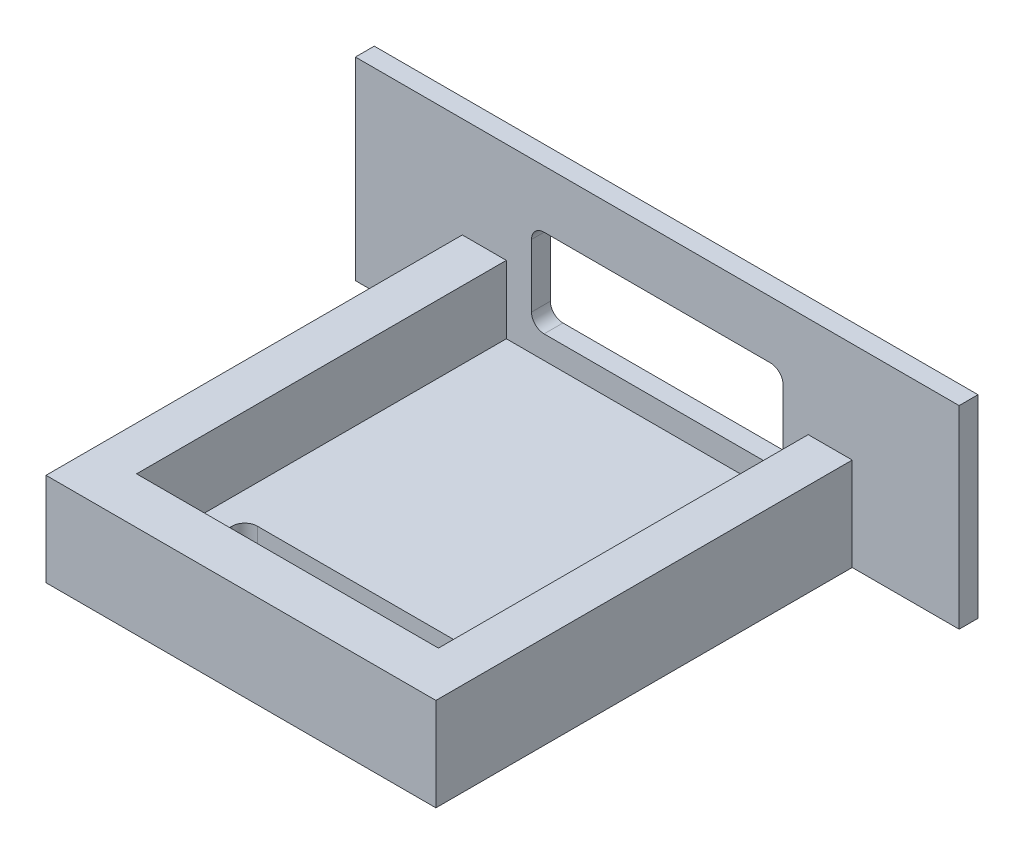
ISO-10303-21;
HEADER;
FILE_DESCRIPTION(('STEP AP214'),'2;1');
FILE_NAME('part.step','',(''),(''),'','','');
FILE_SCHEMA(('AUTOMOTIVE_DESIGN { 1 0 10303 214 1 1 1 1 }'));
ENDSEC;
DATA;
#1=APPLICATION_CONTEXT('core data for automotive mechanical design processes');
#2=APPLICATION_PROTOCOL_DEFINITION('international standard','automotive_design',2000,#1);
#3=PRODUCT_CONTEXT('',#1,'mechanical');
#4=PRODUCT('Part','Part','',(#3));
#5=PRODUCT_RELATED_PRODUCT_CATEGORY('part','',(#4));
#6=PRODUCT_DEFINITION_FORMATION('','',#4);
#7=PRODUCT_DEFINITION_CONTEXT('part definition',#1,'design');
#8=PRODUCT_DEFINITION('design','',#6,#7);
#9=PRODUCT_DEFINITION_SHAPE('','',#8);
#10=(LENGTH_UNIT() NAMED_UNIT(*) SI_UNIT(.MILLI.,.METRE.));
#11=(NAMED_UNIT(*) PLANE_ANGLE_UNIT() SI_UNIT($,.RADIAN.));
#12=(NAMED_UNIT(*) SI_UNIT($,.STERADIAN.) SOLID_ANGLE_UNIT());
#13=UNCERTAINTY_MEASURE_WITH_UNIT(LENGTH_MEASURE(1.E-05),#10,'distance_accuracy_value','');
#14=(GEOMETRIC_REPRESENTATION_CONTEXT(3) GLOBAL_UNCERTAINTY_ASSIGNED_CONTEXT((#13)) GLOBAL_UNIT_ASSIGNED_CONTEXT((#10,
#11,#12)) REPRESENTATION_CONTEXT('',''));
#15=CARTESIAN_POINT('',(0.,0.,0.));
#16=DIRECTION('',(0.,0.,1.));
#17=DIRECTION('',(1.,0.,0.));
#18=AXIS2_PLACEMENT_3D('',#15,#16,#17);
#19=CARTESIAN_POINT('',(-6.75,2.7,0.0240988979113407));
#20=DIRECTION('',(0.,0.,1.));
#21=DIRECTION('',(1.,0.,0.));
#22=AXIS2_PLACEMENT_3D('',#19,#20,#21);
#23=PLANE('',#22);
#24=DIRECTION('',(1.,0.,0.));
#25=VECTOR('',#24,1.);
#26=CARTESIAN_POINT('',(6.75,-1.,0.0240988979113409));
#27=LINE('',#26,#25);
#28=CARTESIAN_POINT('',(-12.,-1.,0.0240988979113409));
#29=VERTEX_POINT('',#28);
#30=CARTESIAN_POINT('',(12.,-1.,0.0240988979113409));
#31=VERTEX_POINT('',#30);
#32=EDGE_CURVE('E484',#29,#31,#27,.T.);
#33=ORIENTED_EDGE('',*,*,#32,.F.);
#34=DIRECTION('',(0.,-1.,0.));
#35=VECTOR('',#34,1.);
#36=CARTESIAN_POINT('',(-12.,6.7,0.0240988979113409));
#37=LINE('',#36,#35);
#38=CARTESIAN_POINT('',(-12.,6.7,0.0240988979113409));
#39=VERTEX_POINT('',#38);
#40=EDGE_CURVE('E476',#39,#29,#37,.T.);
#41=ORIENTED_EDGE('',*,*,#40,.F.);
#42=DIRECTION('',(-1.,0.,0.));
#43=VECTOR('',#42,1.);
#44=CARTESIAN_POINT('',(-12.,6.7,0.0240988979113409));
#45=LINE('',#44,#43);
#46=CARTESIAN_POINT('',(12.,6.7,0.0240988979113409));
#47=VERTEX_POINT('',#46);
#48=EDGE_CURVE('E453',#47,#39,#45,.T.);
#49=ORIENTED_EDGE('',*,*,#48,.F.);
#50=DIRECTION('',(0.,-1.,0.));
#51=VECTOR('',#50,1.);
#52=CARTESIAN_POINT('',(12.,6.7,0.0240988979113409));
#53=LINE('',#52,#51);
#54=EDGE_CURVE('E480',#47,#31,#53,.T.);
#55=ORIENTED_EDGE('',*,*,#54,.T.);
#56=EDGE_LOOP('',(#33,#41,#49,#55));
#57=FACE_BOUND('',#56,.T.);
#58=DIRECTION('',(-1.,0.,0.));
#59=VECTOR('',#58,1.);
#60=CARTESIAN_POINT('',(4.5,0.919,0.0240988979113409));
#61=LINE('',#60,#59);
#62=CARTESIAN_POINT('',(4.5,0.919,0.0240988979113409));
#63=VERTEX_POINT('',#62);
#64=CARTESIAN_POINT('',(-4.5,0.919,0.0240988979113408));
#65=VERTEX_POINT('',#64);
#66=EDGE_CURVE('E407',#63,#65,#61,.T.);
#67=ORIENTED_EDGE('',*,*,#66,.F.);
#68=CARTESIAN_POINT('',(4.5,1.419,0.0240988979113409));
#69=DIRECTION('',(0.,0.,-1.));
#70=DIRECTION('',(1.,0.,0.));
#71=AXIS2_PLACEMENT_3D('',#68,#69,#70);
#72=CIRCLE('',#71,0.5);
#73=CARTESIAN_POINT('',(5.,1.419,0.0240988979113409));
#74=VERTEX_POINT('',#73);
#75=EDGE_CURVE('E375',#74,#63,#72,.T.);
#76=ORIENTED_EDGE('',*,*,#75,.F.);
#77=DIRECTION('',(0.,-1.,0.));
#78=VECTOR('',#77,1.);
#79=CARTESIAN_POINT('',(5.,1.419,0.0240988979113409));
#80=LINE('',#79,#78);
#81=CARTESIAN_POINT('',(5.,3.919,0.0240988979113409));
#82=VERTEX_POINT('',#81);
#83=EDGE_CURVE('E389',#82,#74,#80,.T.);
#84=ORIENTED_EDGE('',*,*,#83,.F.);
#85=CARTESIAN_POINT('',(4.5,3.919,0.0240988979113409));
#86=DIRECTION('',(0.,0.,-1.));
#87=DIRECTION('',(1.,0.,0.));
#88=AXIS2_PLACEMENT_3D('',#85,#86,#87);
#89=CIRCLE('',#88,0.5);
#90=CARTESIAN_POINT('',(4.5,4.419,0.0240988979113409));
#91=VERTEX_POINT('',#90);
#92=EDGE_CURVE('E391',#91,#82,#89,.T.);
#93=ORIENTED_EDGE('',*,*,#92,.F.);
#94=DIRECTION('',(1.,0.,0.));
#95=VECTOR('',#94,1.);
#96=CARTESIAN_POINT('',(4.5,4.419,0.0240988979113409));
#97=LINE('',#96,#95);
#98=CARTESIAN_POINT('',(-4.5,4.419,0.0240988979113408));
#99=VERTEX_POINT('',#98);
#100=EDGE_CURVE('E395',#99,#91,#97,.T.);
#101=ORIENTED_EDGE('',*,*,#100,.F.);
#102=CARTESIAN_POINT('',(-4.5,3.919,0.0240988979113408));
#103=DIRECTION('',(0.,0.,-1.));
#104=DIRECTION('',(1.,0.,0.));
#105=AXIS2_PLACEMENT_3D('',#102,#103,#104);
#106=CIRCLE('',#105,0.5);
#107=CARTESIAN_POINT('',(-5.,3.919,0.0240988979113408));
#108=VERTEX_POINT('',#107);
#109=EDGE_CURVE('E399',#108,#99,#106,.T.);
#110=ORIENTED_EDGE('',*,*,#109,.F.);
#111=DIRECTION('',(0.,1.,0.));
#112=VECTOR('',#111,1.);
#113=CARTESIAN_POINT('',(-5.,1.419,0.0240988979113408));
#114=LINE('',#113,#112);
#115=CARTESIAN_POINT('',(-5.,1.419,0.0240988979113408));
#116=VERTEX_POINT('',#115);
#117=EDGE_CURVE('E401',#116,#108,#114,.T.);
#118=ORIENTED_EDGE('',*,*,#117,.F.);
#119=CARTESIAN_POINT('',(-4.5,1.419,0.0240988979113408));
#120=DIRECTION('',(0.,0.,-1.));
#121=DIRECTION('',(-1.,0.,0.));
#122=AXIS2_PLACEMENT_3D('',#119,#120,#121);
#123=CIRCLE('',#122,0.5);
#124=EDGE_CURVE('E406',#65,#116,#123,.T.);
#125=ORIENTED_EDGE('',*,*,#124,.F.);
#126=EDGE_LOOP('',(#67,#76,#84,#93,#101,#110,#118,#125));
#127=FACE_BOUND('',#126,.T.);
#128=ADVANCED_FACE('F50',(#57,#127),#23,.F.);
#129=CARTESIAN_POINT('',(-6.,2.7,0.774098897911341));
#130=DIRECTION('',(0.,0.,1.));
#131=DIRECTION('',(1.,0.,0.));
#132=AXIS2_PLACEMENT_3D('',#129,#130,#131);
#133=PLANE('',#132);
#134=DIRECTION('',(0.,-1.,0.));
#135=VECTOR('',#134,1.);
#136=CARTESIAN_POINT('',(-7.75,2.7,0.774098897911343));
#137=LINE('',#136,#135);
#138=CARTESIAN_POINT('',(-7.75,2.7,0.774098897911343));
#139=VERTEX_POINT('',#138);
#140=CARTESIAN_POINT('',(-7.75,-1.,0.774098897911342));
#141=VERTEX_POINT('',#140);
#142=EDGE_CURVE('E313',#139,#141,#137,.T.);
#143=ORIENTED_EDGE('',*,*,#142,.F.);
#144=DIRECTION('',(1.,0.,0.));
#145=VECTOR('',#144,1.);
#146=CARTESIAN_POINT('',(-12.,2.7,0.774098897911341));
#147=LINE('',#146,#145);
#148=CARTESIAN_POINT('',(-6.,2.7,0.774098897911341));
#149=VERTEX_POINT('',#148);
#150=EDGE_CURVE('E464',#139,#149,#147,.T.);
#151=ORIENTED_EDGE('',*,*,#150,.T.);
#152=DIRECTION('',(0.,-1.,0.));
#153=VECTOR('',#152,1.);
#154=CARTESIAN_POINT('',(-6.,2.7,0.774098897911341));
#155=LINE('',#154,#153);
#156=CARTESIAN_POINT('',(-6.,0.,0.774098897911341));
#157=VERTEX_POINT('',#156);
#158=EDGE_CURVE('E496',#149,#157,#155,.T.);
#159=ORIENTED_EDGE('',*,*,#158,.T.);
#160=DIRECTION('',(-1.,0.,0.));
#161=VECTOR('',#160,1.);
#162=CARTESIAN_POINT('',(-6.,0.,0.774098897911341));
#163=LINE('',#162,#161);
#164=CARTESIAN_POINT('',(6.,0.,0.774098897911341));
#165=VERTEX_POINT('',#164);
#166=EDGE_CURVE('E499',#165,#157,#163,.T.);
#167=ORIENTED_EDGE('',*,*,#166,.F.);
#168=DIRECTION('',(0.,-1.,0.));
#169=VECTOR('',#168,1.);
#170=CARTESIAN_POINT('',(6.,2.7,0.774098897911341));
#171=LINE('',#170,#169);
#172=CARTESIAN_POINT('',(6.,2.7,0.774098897911341));
#173=VERTEX_POINT('',#172);
#174=EDGE_CURVE('E514',#173,#165,#171,.T.);
#175=ORIENTED_EDGE('',*,*,#174,.F.);
#176=CARTESIAN_POINT('',(7.75,2.7,0.774098897911341));
#177=VERTEX_POINT('',#176);
#178=EDGE_CURVE('E469',#173,#177,#147,.T.);
#179=ORIENTED_EDGE('',*,*,#178,.T.);
#180=DIRECTION('',(0.,1.,0.));
#181=VECTOR('',#180,1.);
#182=CARTESIAN_POINT('',(7.75,-1.,0.774098897911341));
#183=LINE('',#182,#181);
#184=CARTESIAN_POINT('',(7.75,-1.,0.774098897911341));
#185=VERTEX_POINT('',#184);
#186=EDGE_CURVE('E331',#185,#177,#183,.T.);
#187=ORIENTED_EDGE('',*,*,#186,.F.);
#188=DIRECTION('',(-1.,0.,0.));
#189=VECTOR('',#188,1.);
#190=CARTESIAN_POINT('',(12.,-1.,0.774098897911341));
#191=LINE('',#190,#189);
#192=CARTESIAN_POINT('',(12.,-1.,0.774098897911341));
#193=VERTEX_POINT('',#192);
#194=EDGE_CURVE('E356',#193,#185,#191,.T.);
#195=ORIENTED_EDGE('',*,*,#194,.F.);
#196=DIRECTION('',(0.,-1.,0.));
#197=VECTOR('',#196,1.);
#198=CARTESIAN_POINT('',(12.,6.7,0.774098897911341));
#199=LINE('',#198,#197);
#200=CARTESIAN_POINT('',(12.,6.7,0.774098897911341));
#201=VERTEX_POINT('',#200);
#202=EDGE_CURVE('E461',#201,#193,#199,.T.);
#203=ORIENTED_EDGE('',*,*,#202,.F.);
#204=DIRECTION('',(1.,0.,0.));
#205=VECTOR('',#204,1.);
#206=CARTESIAN_POINT('',(-12.,6.7,0.774098897911341));
#207=LINE('',#206,#205);
#208=CARTESIAN_POINT('',(-12.,6.7,0.774098897911341));
#209=VERTEX_POINT('',#208);
#210=EDGE_CURVE('E460',#209,#201,#207,.T.);
#211=ORIENTED_EDGE('',*,*,#210,.F.);
#212=DIRECTION('',(0.,-1.,0.));
#213=VECTOR('',#212,1.);
#214=CARTESIAN_POINT('',(-12.,6.7,0.774098897911341));
#215=LINE('',#214,#213);
#216=CARTESIAN_POINT('',(-12.,-1.,0.774098897911341));
#217=VERTEX_POINT('',#216);
#218=EDGE_CURVE('E471',#209,#217,#215,.T.);
#219=ORIENTED_EDGE('',*,*,#218,.T.);
#220=DIRECTION('',(-1.,0.,0.));
#221=VECTOR('',#220,1.);
#222=CARTESIAN_POINT('',(-6.75,-1.,0.774098897911343));
#223=LINE('',#222,#221);
#224=EDGE_CURVE('E353',#141,#217,#223,.T.);
#225=ORIENTED_EDGE('',*,*,#224,.F.);
#226=EDGE_LOOP('',(#143,#151,#159,#167,#175,#179,#187,#195,#203,#211,#219,#225));
#227=FACE_BOUND('',#226,.T.);
#228=CARTESIAN_POINT('',(4.5,1.419,0.774098897911342));
#229=DIRECTION('',(0.,0.,1.));
#230=DIRECTION('',(1.,0.,0.));
#231=AXIS2_PLACEMENT_3D('',#228,#229,#230);
#232=CIRCLE('',#231,0.5);
#233=CARTESIAN_POINT('',(5.,1.419,0.774098897911342));
#234=VERTEX_POINT('',#233);
#235=CARTESIAN_POINT('',(4.5,0.919,0.774098897911342));
#236=VERTEX_POINT('',#235);
#237=EDGE_CURVE('E365',#234,#236,#232,.F.);
#238=ORIENTED_EDGE('',*,*,#237,.T.);
#239=DIRECTION('',(-1.,0.,0.));
#240=VECTOR('',#239,1.);
#241=CARTESIAN_POINT('',(4.5,0.919,0.774098897911342));
#242=LINE('',#241,#240);
#243=CARTESIAN_POINT('',(-4.5,0.919,0.774098897911342));
#244=VERTEX_POINT('',#243);
#245=EDGE_CURVE('E361',#236,#244,#242,.T.);
#246=ORIENTED_EDGE('',*,*,#245,.T.);
#247=CARTESIAN_POINT('',(-4.5,1.419,0.774098897911342));
#248=DIRECTION('',(0.,0.,1.));
#249=DIRECTION('',(1.,0.,0.));
#250=AXIS2_PLACEMENT_3D('',#247,#248,#249);
#251=CIRCLE('',#250,0.5);
#252=CARTESIAN_POINT('',(-5.,1.419,0.774098897911342));
#253=VERTEX_POINT('',#252);
#254=EDGE_CURVE('E438',#244,#253,#251,.F.);
#255=ORIENTED_EDGE('',*,*,#254,.T.);
#256=DIRECTION('',(0.,1.,0.));
#257=VECTOR('',#256,1.);
#258=CARTESIAN_POINT('',(-5.,1.419,0.774098897911342));
#259=LINE('',#258,#257);
#260=CARTESIAN_POINT('',(-5.,3.919,0.774098897911341));
#261=VERTEX_POINT('',#260);
#262=EDGE_CURVE('E373',#253,#261,#259,.T.);
#263=ORIENTED_EDGE('',*,*,#262,.T.);
#264=CARTESIAN_POINT('',(-4.5,3.919,0.774098897911342));
#265=DIRECTION('',(0.,0.,1.));
#266=DIRECTION('',(1.,0.,0.));
#267=AXIS2_PLACEMENT_3D('',#264,#265,#266);
#268=CIRCLE('',#267,0.5);
#269=CARTESIAN_POINT('',(-4.5,4.419,0.774098897911342));
#270=VERTEX_POINT('',#269);
#271=EDGE_CURVE('E380',#261,#270,#268,.F.);
#272=ORIENTED_EDGE('',*,*,#271,.T.);
#273=DIRECTION('',(1.,0.,0.));
#274=VECTOR('',#273,1.);
#275=CARTESIAN_POINT('',(4.5,4.419,0.774098897911342));
#276=LINE('',#275,#274);
#277=CARTESIAN_POINT('',(4.5,4.419,0.774098897911342));
#278=VERTEX_POINT('',#277);
#279=EDGE_CURVE('E382',#270,#278,#276,.T.);
#280=ORIENTED_EDGE('',*,*,#279,.T.);
#281=CARTESIAN_POINT('',(4.5,3.919,0.774098897911342));
#282=DIRECTION('',(0.,0.,1.));
#283=DIRECTION('',(1.,0.,0.));
#284=AXIS2_PLACEMENT_3D('',#281,#282,#283);
#285=CIRCLE('',#284,0.5);
#286=CARTESIAN_POINT('',(5.,3.919,0.774098897911342));
#287=VERTEX_POINT('',#286);
#288=EDGE_CURVE('E383',#278,#287,#285,.F.);
#289=ORIENTED_EDGE('',*,*,#288,.T.);
#290=DIRECTION('',(0.,-1.,0.));
#291=VECTOR('',#290,1.);
#292=CARTESIAN_POINT('',(5.,1.419,0.774098897911342));
#293=LINE('',#292,#291);
#294=EDGE_CURVE('E423',#287,#234,#293,.T.);
#295=ORIENTED_EDGE('',*,*,#294,.T.);
#296=EDGE_LOOP('',(#238,#246,#255,#263,#272,#280,#289,#295));
#297=FACE_BOUND('',#296,.T.);
#298=ADVANCED_FACE('F539',(#227,#297),#133,.T.);
#299=CARTESIAN_POINT('',(0.,2.7,0.));
#300=DIRECTION('',(0.,1.,0.));
#301=DIRECTION('',(0.,0.,1.));
#302=AXIS2_PLACEMENT_3D('',#299,#300,#301);
#303=PLANE('',#302);
#304=DIRECTION('',(0.,0.,-1.));
#305=VECTOR('',#304,1.);
#306=CARTESIAN_POINT('',(6.,2.7,14.5740988979113));
#307=LINE('',#306,#305);
#308=CARTESIAN_POINT('',(6.,2.7,15.4740988979113));
#309=VERTEX_POINT('',#308);
#310=EDGE_CURVE('E486',#309,#173,#307,.T.);
#311=ORIENTED_EDGE('',*,*,#310,.F.);
#312=DIRECTION('',(-1.,0.,0.));
#313=VECTOR('',#312,1.);
#314=CARTESIAN_POINT('',(0.,2.7,15.4740988979113));
#315=LINE('',#314,#313);
#316=CARTESIAN_POINT('',(-6.,2.7,15.4740988979113));
#317=VERTEX_POINT('',#316);
#318=EDGE_CURVE('E466',#309,#317,#315,.T.);
#319=ORIENTED_EDGE('',*,*,#318,.T.);
#320=DIRECTION('',(0.,0.,1.));
#321=VECTOR('',#320,1.);
#322=CARTESIAN_POINT('',(-6.,2.7,14.5740988979113));
#323=LINE('',#322,#321);
#324=EDGE_CURVE('E495',#149,#317,#323,.T.);
#325=ORIENTED_EDGE('',*,*,#324,.F.);
#326=ORIENTED_EDGE('',*,*,#150,.F.);
#327=DIRECTION('',(0.,0.,-1.));
#328=VECTOR('',#327,1.);
#329=CARTESIAN_POINT('',(-7.75,2.7,17.3240988979113));
#330=LINE('',#329,#328);
#331=CARTESIAN_POINT('',(-7.75,2.7,17.3240988979113));
#332=VERTEX_POINT('',#331);
#333=EDGE_CURVE('E248',#332,#139,#330,.T.);
#334=ORIENTED_EDGE('',*,*,#333,.F.);
#335=DIRECTION('',(-1.,0.,0.));
#336=VECTOR('',#335,1.);
#337=CARTESIAN_POINT('',(6.75,2.7,17.3240988979113));
#338=LINE('',#337,#336);
#339=CARTESIAN_POINT('',(7.75,2.7,17.3240988979113));
#340=VERTEX_POINT('',#339);
#341=EDGE_CURVE('E344',#340,#332,#338,.T.);
#342=ORIENTED_EDGE('',*,*,#341,.F.);
#343=DIRECTION('',(0.,0.,1.));
#344=VECTOR('',#343,1.);
#345=CARTESIAN_POINT('',(7.75,2.7,0.774098897911341));
#346=LINE('',#345,#344);
#347=EDGE_CURVE('E340',#177,#340,#346,.T.);
#348=ORIENTED_EDGE('',*,*,#347,.F.);
#349=ORIENTED_EDGE('',*,*,#178,.F.);
#350=EDGE_LOOP('',(#311,#319,#325,#326,#334,#342,#348,#349));
#351=FACE_BOUND('',#350,.T.);
#352=ADVANCED_FACE('F532',(#351),#303,.T.);
#353=CARTESIAN_POINT('',(6.,2.7,14.5740988979113));
#354=DIRECTION('',(-1.,0.,0.));
#355=DIRECTION('',(0.,0.,1.));
#356=AXIS2_PLACEMENT_3D('',#353,#354,#355);
#357=PLANE('',#356);
#358=DIRECTION('',(0.,0.,-1.));
#359=VECTOR('',#358,1.);
#360=CARTESIAN_POINT('',(6.,0.,14.5740988979113));
#361=LINE('',#360,#359);
#362=CARTESIAN_POINT('',(6.,0.,14.5740988979113));
#363=VERTEX_POINT('',#362);
#364=EDGE_CURVE('E487',#363,#165,#361,.T.);
#365=ORIENTED_EDGE('',*,*,#364,.F.);
#366=DIRECTION('',(0.,-0.948683298050515,-0.316227766016835));
#367=VECTOR('',#366,1.);
#368=CARTESIAN_POINT('',(6.,0.,14.5740988979113));
#369=LINE('',#368,#367);
#370=EDGE_CURVE('E60',#363,#309,#369,.F.);
#371=ORIENTED_EDGE('',*,*,#370,.T.);
#372=ORIENTED_EDGE('',*,*,#310,.T.);
#373=ORIENTED_EDGE('',*,*,#174,.T.);
#374=EDGE_LOOP('',(#365,#371,#372,#373));
#375=FACE_BOUND('',#374,.T.);
#376=ADVANCED_FACE('F523',(#375),#357,.T.);
#377=CARTESIAN_POINT('',(-6.,2.7,14.5740988979113));
#378=DIRECTION('',(1.,0.,0.));
#379=DIRECTION('',(0.,0.,-1.));
#380=AXIS2_PLACEMENT_3D('',#377,#378,#379);
#381=PLANE('',#380);
#382=DIRECTION('',(0.,0.,1.));
#383=VECTOR('',#382,1.);
#384=CARTESIAN_POINT('',(-6.,0.,14.5740988979113));
#385=LINE('',#384,#383);
#386=CARTESIAN_POINT('',(-6.,0.,14.5740988979113));
#387=VERTEX_POINT('',#386);
#388=EDGE_CURVE('E502',#157,#387,#385,.T.);
#389=ORIENTED_EDGE('',*,*,#388,.F.);
#390=ORIENTED_EDGE('',*,*,#158,.F.);
#391=ORIENTED_EDGE('',*,*,#324,.T.);
#392=DIRECTION('',(0.,0.948683298050515,0.316227766016835));
#393=VECTOR('',#392,1.);
#394=CARTESIAN_POINT('',(-6.,0.,14.5740988979113));
#395=LINE('',#394,#393);
#396=EDGE_CURVE('E11',#317,#387,#395,.F.);
#397=ORIENTED_EDGE('',*,*,#396,.T.);
#398=EDGE_LOOP('',(#389,#390,#391,#397));
#399=FACE_BOUND('',#398,.T.);
#400=ADVANCED_FACE('F568',(#399),#381,.T.);
#401=CARTESIAN_POINT('',(0.,0.,0.));
#402=DIRECTION('',(0.,1.,0.));
#403=DIRECTION('',(0.,0.,1.));
#404=AXIS2_PLACEMENT_3D('',#401,#402,#403);
#405=PLANE('',#404);
#406=CARTESIAN_POINT('',(4.5,0.,13.0740988979113));
#407=DIRECTION('',(0.,1.,0.));
#408=DIRECTION('',(0.,0.,1.));
#409=AXIS2_PLACEMENT_3D('',#406,#407,#408);
#410=CIRCLE('',#409,0.5);
#411=CARTESIAN_POINT('',(4.49999999999999,0.,13.5740988979113));
#412=VERTEX_POINT('',#411);
#413=CARTESIAN_POINT('',(5.,0.,13.0740988979113));
#414=VERTEX_POINT('',#413);
#415=EDGE_CURVE('E63',#412,#414,#410,.T.);
#416=ORIENTED_EDGE('',*,*,#415,.F.);
#417=DIRECTION('',(1.,0.,0.));
#418=VECTOR('',#417,1.);
#419=CARTESIAN_POINT('',(-4.5,0.,13.5740988979113));
#420=LINE('',#419,#418);
#421=CARTESIAN_POINT('',(-4.5,0.,13.5740988979113));
#422=VERTEX_POINT('',#421);
#423=EDGE_CURVE('E245',#422,#412,#420,.T.);
#424=ORIENTED_EDGE('',*,*,#423,.F.);
#425=CARTESIAN_POINT('',(-4.5,0.,13.0740988979113));
#426=DIRECTION('',(0.,1.,0.));
#427=DIRECTION('',(0.,0.,1.));
#428=AXIS2_PLACEMENT_3D('',#425,#426,#427);
#429=CIRCLE('',#428,0.5);
#430=CARTESIAN_POINT('',(-5.,0.,13.0740988979113));
#431=VERTEX_POINT('',#430);
#432=EDGE_CURVE('E285',#431,#422,#429,.T.);
#433=ORIENTED_EDGE('',*,*,#432,.F.);
#434=DIRECTION('',(0.,0.,1.));
#435=VECTOR('',#434,1.);
#436=CARTESIAN_POINT('',(-5.,0.,12.6740988979113));
#437=LINE('',#436,#435);
#438=CARTESIAN_POINT('',(-5.,0.,12.6740988979113));
#439=VERTEX_POINT('',#438);
#440=EDGE_CURVE('E281',#439,#431,#437,.T.);
#441=ORIENTED_EDGE('',*,*,#440,.F.);
#442=CARTESIAN_POINT('',(-4.5,0.,12.6740988979113));
#443=DIRECTION('',(0.,1.,0.));
#444=DIRECTION('',(0.,0.,1.));
#445=AXIS2_PLACEMENT_3D('',#442,#443,#444);
#446=CIRCLE('',#445,0.5);
#447=CARTESIAN_POINT('',(-4.5,0.,12.1740988979113));
#448=VERTEX_POINT('',#447);
#449=EDGE_CURVE('E276',#448,#439,#446,.T.);
#450=ORIENTED_EDGE('',*,*,#449,.F.);
#451=DIRECTION('',(-1.,0.,0.));
#452=VECTOR('',#451,1.);
#453=CARTESIAN_POINT('',(-4.5,0.,12.1740988979113));
#454=LINE('',#453,#452);
#455=CARTESIAN_POINT('',(4.5,0.,12.1740988979113));
#456=VERTEX_POINT('',#455);
#457=EDGE_CURVE('E271',#456,#448,#454,.T.);
#458=ORIENTED_EDGE('',*,*,#457,.F.);
#459=CARTESIAN_POINT('',(4.5,0.,12.6740988979113));
#460=DIRECTION('',(0.,1.,0.));
#461=DIRECTION('',(0.,0.,-1.));
#462=AXIS2_PLACEMENT_3D('',#459,#460,#461);
#463=CIRCLE('',#462,0.5);
#464=CARTESIAN_POINT('',(5.,0.,12.6740988979113));
#465=VERTEX_POINT('',#464);
#466=EDGE_CURVE('E269',#465,#456,#463,.T.);
#467=ORIENTED_EDGE('',*,*,#466,.F.);
#468=DIRECTION('',(0.,0.,-1.));
#469=VECTOR('',#468,1.);
#470=CARTESIAN_POINT('',(5.,0.,12.6740988979113));
#471=LINE('',#470,#469);
#472=EDGE_CURVE('E261',#414,#465,#471,.T.);
#473=ORIENTED_EDGE('',*,*,#472,.F.);
#474=EDGE_LOOP('',(#416,#424,#433,#441,#450,#458,#467,#473));
#475=FACE_BOUND('',#474,.T.);
#476=DIRECTION('',(1.,0.,0.));
#477=VECTOR('',#476,1.);
#478=CARTESIAN_POINT('',(-6.,0.,14.5740988979113));
#479=LINE('',#478,#477);
#480=EDGE_CURVE('E491',#387,#363,#479,.T.);
#481=ORIENTED_EDGE('',*,*,#480,.T.);
#482=ORIENTED_EDGE('',*,*,#364,.T.);
#483=ORIENTED_EDGE('',*,*,#166,.T.);
#484=ORIENTED_EDGE('',*,*,#388,.T.);
#485=EDGE_LOOP('',(#481,#482,#483,#484));
#486=FACE_BOUND('',#485,.T.);
#487=ADVANCED_FACE('F569',(#475,#486),#405,.T.);
#488=CARTESIAN_POINT('',(0.,-1.,0.));
#489=DIRECTION('',(0.,1.,0.));
#490=DIRECTION('',(0.,0.,1.));
#491=AXIS2_PLACEMENT_3D('',#488,#489,#490);
#492=PLANE('',#491);
#493=DIRECTION('',(-1.,0.,0.));
#494=VECTOR('',#493,1.);
#495=CARTESIAN_POINT('',(-4.5,-1.,13.5740988979113));
#496=LINE('',#495,#494);
#497=CARTESIAN_POINT('',(4.49999999999999,-1.,13.5740988979113));
#498=VERTEX_POINT('',#497);
#499=CARTESIAN_POINT('',(-4.5,-1.,13.5740988979113));
#500=VERTEX_POINT('',#499);
#501=EDGE_CURVE('E259',#498,#500,#496,.T.);
#502=ORIENTED_EDGE('',*,*,#501,.F.);
#503=CARTESIAN_POINT('',(4.5,-1.,13.0740988979113));
#504=DIRECTION('',(0.,1.,0.));
#505=DIRECTION('',(0.,0.,1.));
#506=AXIS2_PLACEMENT_3D('',#503,#504,#505);
#507=CIRCLE('',#506,0.5);
#508=CARTESIAN_POINT('',(5.,-1.,13.0740988979113));
#509=VERTEX_POINT('',#508);
#510=EDGE_CURVE('E232',#509,#498,#507,.F.);
#511=ORIENTED_EDGE('',*,*,#510,.F.);
#512=DIRECTION('',(0.,0.,1.));
#513=VECTOR('',#512,1.);
#514=CARTESIAN_POINT('',(5.,-1.,12.6740988979113));
#515=LINE('',#514,#513);
#516=CARTESIAN_POINT('',(5.,-1.,12.6740988979113));
#517=VERTEX_POINT('',#516);
#518=EDGE_CURVE('E244',#517,#509,#515,.T.);
#519=ORIENTED_EDGE('',*,*,#518,.F.);
#520=CARTESIAN_POINT('',(4.5,-1.,12.6740988979113));
#521=DIRECTION('',(0.,1.,0.));
#522=DIRECTION('',(0.,0.,1.));
#523=AXIS2_PLACEMENT_3D('',#520,#521,#522);
#524=CIRCLE('',#523,0.5);
#525=CARTESIAN_POINT('',(4.5,-1.,12.1740988979113));
#526=VERTEX_POINT('',#525);
#527=EDGE_CURVE('E75',#526,#517,#524,.F.);
#528=ORIENTED_EDGE('',*,*,#527,.F.);
#529=DIRECTION('',(1.,0.,0.));
#530=VECTOR('',#529,1.);
#531=CARTESIAN_POINT('',(-4.5,-1.,12.1740988979113));
#532=LINE('',#531,#530);
#533=CARTESIAN_POINT('',(-4.5,-1.,12.1740988979113));
#534=VERTEX_POINT('',#533);
#535=EDGE_CURVE('E913',#534,#526,#532,.T.);
#536=ORIENTED_EDGE('',*,*,#535,.F.);
#537=CARTESIAN_POINT('',(-4.5,-1.,12.6740988979113));
#538=DIRECTION('',(0.,1.,0.));
#539=DIRECTION('',(0.,0.,1.));
#540=AXIS2_PLACEMENT_3D('',#537,#538,#539);
#541=CIRCLE('',#540,0.5);
#542=CARTESIAN_POINT('',(-5.,-1.,12.6740988979113));
#543=VERTEX_POINT('',#542);
#544=EDGE_CURVE('E916',#543,#534,#541,.F.);
#545=ORIENTED_EDGE('',*,*,#544,.F.);
#546=DIRECTION('',(0.,0.,-1.));
#547=VECTOR('',#546,1.);
#548=CARTESIAN_POINT('',(-5.,-1.,12.6740988979113));
#549=LINE('',#548,#547);
#550=CARTESIAN_POINT('',(-5.,-1.,13.0740988979113));
#551=VERTEX_POINT('',#550);
#552=EDGE_CURVE('E923',#551,#543,#549,.T.);
#553=ORIENTED_EDGE('',*,*,#552,.F.);
#554=CARTESIAN_POINT('',(-4.5,-1.,13.0740988979113));
#555=DIRECTION('',(0.,1.,0.));
#556=DIRECTION('',(0.,0.,1.));
#557=AXIS2_PLACEMENT_3D('',#554,#555,#556);
#558=CIRCLE('',#557,0.5);
#559=EDGE_CURVE('E264',#500,#551,#558,.F.);
#560=ORIENTED_EDGE('',*,*,#559,.F.);
#561=EDGE_LOOP('',(#502,#511,#519,#528,#536,#545,#553,#560));
#562=FACE_BOUND('',#561,.T.);
#563=ORIENTED_EDGE('',*,*,#32,.T.);
#564=DIRECTION('',(0.,0.,1.));
#565=VECTOR('',#564,1.);
#566=CARTESIAN_POINT('',(12.,-1.,0.0240988979113409));
#567=LINE('',#566,#565);
#568=EDGE_CURVE('E354',#31,#193,#567,.T.);
#569=ORIENTED_EDGE('',*,*,#568,.T.);
#570=ORIENTED_EDGE('',*,*,#194,.T.);
#571=DIRECTION('',(0.,0.,-1.));
#572=VECTOR('',#571,1.);
#573=CARTESIAN_POINT('',(7.75,-1.,17.3240988979113));
#574=LINE('',#573,#572);
#575=CARTESIAN_POINT('',(7.75,-1.,17.3240988979113));
#576=VERTEX_POINT('',#575);
#577=EDGE_CURVE('E328',#576,#185,#574,.T.);
#578=ORIENTED_EDGE('',*,*,#577,.F.);
#579=DIRECTION('',(1.,0.,0.));
#580=VECTOR('',#579,1.);
#581=CARTESIAN_POINT('',(-6.75,-1.,17.3240988979113));
#582=LINE('',#581,#580);
#583=CARTESIAN_POINT('',(-7.75,-1.,17.3240988979113));
#584=VERTEX_POINT('',#583);
#585=EDGE_CURVE('E343',#584,#576,#582,.T.);
#586=ORIENTED_EDGE('',*,*,#585,.F.);
#587=DIRECTION('',(0.,0.,1.));
#588=VECTOR('',#587,1.);
#589=CARTESIAN_POINT('',(-7.75,-1.,0.774098897911342));
#590=LINE('',#589,#588);
#591=EDGE_CURVE('E320',#141,#584,#590,.T.);
#592=ORIENTED_EDGE('',*,*,#591,.F.);
#593=ORIENTED_EDGE('',*,*,#224,.T.);
#594=DIRECTION('',(0.,0.,-1.));
#595=VECTOR('',#594,1.);
#596=CARTESIAN_POINT('',(-12.,-1.,0.774098897911341));
#597=LINE('',#596,#595);
#598=EDGE_CURVE('E347',#217,#29,#597,.T.);
#599=ORIENTED_EDGE('',*,*,#598,.T.);
#600=EDGE_LOOP('',(#563,#569,#570,#578,#586,#592,#593,#599));
#601=FACE_BOUND('',#600,.T.);
#602=ADVANCED_FACE('F255',(#562,#601),#492,.F.);
#603=CARTESIAN_POINT('',(12.,6.7,0.0240988979113409));
#604=DIRECTION('',(-1.,0.,0.));
#605=DIRECTION('',(0.,0.,1.));
#606=AXIS2_PLACEMENT_3D('',#603,#604,#605);
#607=PLANE('',#606);
#608=ORIENTED_EDGE('',*,*,#202,.T.);
#609=ORIENTED_EDGE('',*,*,#568,.F.);
#610=ORIENTED_EDGE('',*,*,#54,.F.);
#611=DIRECTION('',(0.,0.,-1.));
#612=VECTOR('',#611,1.);
#613=CARTESIAN_POINT('',(12.,6.7,0.0240988979113409));
#614=LINE('',#613,#612);
#615=EDGE_CURVE('E387',#201,#47,#614,.T.);
#616=ORIENTED_EDGE('',*,*,#615,.F.);
#617=EDGE_LOOP('',(#608,#609,#610,#616));
#618=FACE_BOUND('',#617,.T.);
#619=ADVANCED_FACE('F547',(#618),#607,.F.);
#620=CARTESIAN_POINT('',(-12.,6.7,0.0240988979113409));
#621=DIRECTION('',(1.,0.,0.));
#622=DIRECTION('',(0.,0.,-1.));
#623=AXIS2_PLACEMENT_3D('',#620,#621,#622);
#624=PLANE('',#623);
#625=ORIENTED_EDGE('',*,*,#40,.T.);
#626=ORIENTED_EDGE('',*,*,#598,.F.);
#627=ORIENTED_EDGE('',*,*,#218,.F.);
#628=DIRECTION('',(0.,0.,1.));
#629=VECTOR('',#628,1.);
#630=CARTESIAN_POINT('',(-12.,6.7,0.0240988979113409));
#631=LINE('',#630,#629);
#632=EDGE_CURVE('E457',#39,#209,#631,.T.);
#633=ORIENTED_EDGE('',*,*,#632,.F.);
#634=EDGE_LOOP('',(#625,#626,#627,#633));
#635=FACE_BOUND('',#634,.T.);
#636=ADVANCED_FACE('F556',(#635),#624,.F.);
#637=CARTESIAN_POINT('',(0.,6.7,0.));
#638=DIRECTION('',(0.,1.,0.));
#639=DIRECTION('',(0.,0.,1.));
#640=AXIS2_PLACEMENT_3D('',#637,#638,#639);
#641=PLANE('',#640);
#642=ORIENTED_EDGE('',*,*,#615,.T.);
#643=ORIENTED_EDGE('',*,*,#48,.T.);
#644=ORIENTED_EDGE('',*,*,#632,.T.);
#645=ORIENTED_EDGE('',*,*,#210,.T.);
#646=EDGE_LOOP('',(#642,#643,#644,#645));
#647=FACE_BOUND('',#646,.T.);
#648=ADVANCED_FACE('F552',(#647),#641,.T.);
#649=CARTESIAN_POINT('',(4.5,1.419,15.3250988979113));
#650=DIRECTION('',(0.,0.,-1.));
#651=DIRECTION('',(-1.,0.,0.));
#652=AXIS2_PLACEMENT_3D('',#649,#650,#651);
#653=CYLINDRICAL_SURFACE('',#652,0.5);
#654=DIRECTION('',(0.,0.,-1.));
#655=VECTOR('',#654,1.);
#656=CARTESIAN_POINT('',(5.,1.419,15.3250988979113));
#657=LINE('',#656,#655);
#658=EDGE_CURVE('E424',#234,#74,#657,.T.);
#659=ORIENTED_EDGE('',*,*,#658,.T.);
#660=ORIENTED_EDGE('',*,*,#75,.T.);
#661=DIRECTION('',(0.,0.,-1.));
#662=VECTOR('',#661,1.);
#663=CARTESIAN_POINT('',(4.5,0.919,15.3250988979113));
#664=LINE('',#663,#662);
#665=EDGE_CURVE('E417',#236,#63,#664,.T.);
#666=ORIENTED_EDGE('',*,*,#665,.F.);
#667=ORIENTED_EDGE('',*,*,#237,.F.);
#668=EDGE_LOOP('',(#659,#660,#666,#667));
#669=FACE_BOUND('',#668,.T.);
#670=ADVANCED_FACE('F747',(#669),#653,.F.);
#671=CARTESIAN_POINT('',(-4.5,1.419,15.3250988979113));
#672=DIRECTION('',(0.,0.,-1.));
#673=DIRECTION('',(-1.,0.,0.));
#674=AXIS2_PLACEMENT_3D('',#671,#672,#673);
#675=CYLINDRICAL_SURFACE('',#674,0.5);
#676=DIRECTION('',(0.,0.,-1.));
#677=VECTOR('',#676,1.);
#678=CARTESIAN_POINT('',(-4.5,0.919,15.3250988979113));
#679=LINE('',#678,#677);
#680=EDGE_CURVE('E370',#244,#65,#679,.T.);
#681=ORIENTED_EDGE('',*,*,#680,.T.);
#682=ORIENTED_EDGE('',*,*,#124,.T.);
#683=DIRECTION('',(0.,0.,-1.));
#684=VECTOR('',#683,1.);
#685=CARTESIAN_POINT('',(-5.,1.419,15.3250988979113));
#686=LINE('',#685,#684);
#687=EDGE_CURVE('E368',#253,#116,#686,.T.);
#688=ORIENTED_EDGE('',*,*,#687,.F.);
#689=ORIENTED_EDGE('',*,*,#254,.F.);
#690=EDGE_LOOP('',(#681,#682,#688,#689));
#691=FACE_BOUND('',#690,.T.);
#692=ADVANCED_FACE('F741',(#691),#675,.F.);
#693=CARTESIAN_POINT('',(4.5,0.919,15.3250988979113));
#694=DIRECTION('',(0.,-1.,0.));
#695=DIRECTION('',(0.,0.,-1.));
#696=AXIS2_PLACEMENT_3D('',#693,#694,#695);
#697=PLANE('',#696);
#698=ORIENTED_EDGE('',*,*,#665,.T.);
#699=ORIENTED_EDGE('',*,*,#66,.T.);
#700=ORIENTED_EDGE('',*,*,#680,.F.);
#701=ORIENTED_EDGE('',*,*,#245,.F.);
#702=EDGE_LOOP('',(#698,#699,#700,#701));
#703=FACE_BOUND('',#702,.T.);
#704=ADVANCED_FACE('F738',(#703),#697,.F.);
#705=CARTESIAN_POINT('',(5.,1.419,15.3250988979113));
#706=DIRECTION('',(1.,0.,0.));
#707=DIRECTION('',(0.,0.,-1.));
#708=AXIS2_PLACEMENT_3D('',#705,#706,#707);
#709=PLANE('',#708);
#710=DIRECTION('',(0.,0.,-1.));
#711=VECTOR('',#710,1.);
#712=CARTESIAN_POINT('',(5.,3.919,15.3250988979113));
#713=LINE('',#712,#711);
#714=EDGE_CURVE('E385',#287,#82,#713,.T.);
#715=ORIENTED_EDGE('',*,*,#714,.T.);
#716=ORIENTED_EDGE('',*,*,#83,.T.);
#717=ORIENTED_EDGE('',*,*,#658,.F.);
#718=ORIENTED_EDGE('',*,*,#294,.F.);
#719=EDGE_LOOP('',(#715,#716,#717,#718));
#720=FACE_BOUND('',#719,.T.);
#721=ADVANCED_FACE('F732',(#720),#709,.F.);
#722=CARTESIAN_POINT('',(4.5,3.919,15.3250988979113));
#723=DIRECTION('',(0.,0.,-1.));
#724=DIRECTION('',(-1.,0.,0.));
#725=AXIS2_PLACEMENT_3D('',#722,#723,#724);
#726=CYLINDRICAL_SURFACE('',#725,0.5);
#727=DIRECTION('',(0.,0.,-1.));
#728=VECTOR('',#727,1.);
#729=CARTESIAN_POINT('',(4.5,4.419,15.3250988979113));
#730=LINE('',#729,#728);
#731=EDGE_CURVE('E377',#278,#91,#730,.T.);
#732=ORIENTED_EDGE('',*,*,#731,.T.);
#733=ORIENTED_EDGE('',*,*,#92,.T.);
#734=ORIENTED_EDGE('',*,*,#714,.F.);
#735=ORIENTED_EDGE('',*,*,#288,.F.);
#736=EDGE_LOOP('',(#732,#733,#734,#735));
#737=FACE_BOUND('',#736,.T.);
#738=ADVANCED_FACE('F734',(#737),#726,.F.);
#739=CARTESIAN_POINT('',(4.5,4.419,15.3250988979113));
#740=DIRECTION('',(0.,1.,0.));
#741=DIRECTION('',(0.,0.,1.));
#742=AXIS2_PLACEMENT_3D('',#739,#740,#741);
#743=PLANE('',#742);
#744=DIRECTION('',(0.,0.,-1.));
#745=VECTOR('',#744,1.);
#746=CARTESIAN_POINT('',(-4.5,4.419,15.3250988979113));
#747=LINE('',#746,#745);
#748=EDGE_CURVE('E372',#270,#99,#747,.T.);
#749=ORIENTED_EDGE('',*,*,#748,.T.);
#750=ORIENTED_EDGE('',*,*,#100,.T.);
#751=ORIENTED_EDGE('',*,*,#731,.F.);
#752=ORIENTED_EDGE('',*,*,#279,.F.);
#753=EDGE_LOOP('',(#749,#750,#751,#752));
#754=FACE_BOUND('',#753,.T.);
#755=ADVANCED_FACE('F730',(#754),#743,.F.);
#756=CARTESIAN_POINT('',(-4.5,3.919,15.3250988979113));
#757=DIRECTION('',(0.,0.,-1.));
#758=DIRECTION('',(-1.,0.,0.));
#759=AXIS2_PLACEMENT_3D('',#756,#757,#758);
#760=CYLINDRICAL_SURFACE('',#759,0.5);
#761=DIRECTION('',(0.,0.,-1.));
#762=VECTOR('',#761,1.);
#763=CARTESIAN_POINT('',(-5.,3.919,15.3250988979113));
#764=LINE('',#763,#762);
#765=EDGE_CURVE('E367',#261,#108,#764,.T.);
#766=ORIENTED_EDGE('',*,*,#765,.T.);
#767=ORIENTED_EDGE('',*,*,#109,.T.);
#768=ORIENTED_EDGE('',*,*,#748,.F.);
#769=ORIENTED_EDGE('',*,*,#271,.F.);
#770=EDGE_LOOP('',(#766,#767,#768,#769));
#771=FACE_BOUND('',#770,.T.);
#772=ADVANCED_FACE('F724',(#771),#760,.F.);
#773=CARTESIAN_POINT('',(-5.,1.419,15.3250988979113));
#774=DIRECTION('',(-1.,0.,0.));
#775=DIRECTION('',(0.,-1.,0.));
#776=AXIS2_PLACEMENT_3D('',#773,#774,#775);
#777=PLANE('',#776);
#778=ORIENTED_EDGE('',*,*,#687,.T.);
#779=ORIENTED_EDGE('',*,*,#117,.T.);
#780=ORIENTED_EDGE('',*,*,#765,.F.);
#781=ORIENTED_EDGE('',*,*,#262,.F.);
#782=EDGE_LOOP('',(#778,#779,#780,#781));
#783=FACE_BOUND('',#782,.T.);
#784=ADVANCED_FACE('F640',(#783),#777,.F.);
#785=CARTESIAN_POINT('',(0.,0.,17.3240988979113));
#786=DIRECTION('',(0.,0.,1.));
#787=DIRECTION('',(1.,0.,0.));
#788=AXIS2_PLACEMENT_3D('',#785,#786,#787);
#789=PLANE('',#788);
#790=ORIENTED_EDGE('',*,*,#341,.T.);
#791=DIRECTION('',(0.,1.,0.));
#792=VECTOR('',#791,1.);
#793=CARTESIAN_POINT('',(-7.75,-1.,17.3240988979113));
#794=LINE('',#793,#792);
#795=EDGE_CURVE('E324',#584,#332,#794,.T.);
#796=ORIENTED_EDGE('',*,*,#795,.F.);
#797=ORIENTED_EDGE('',*,*,#585,.T.);
#798=DIRECTION('',(0.,-1.,0.));
#799=VECTOR('',#798,1.);
#800=CARTESIAN_POINT('',(7.75,2.7,17.3240988979113));
#801=LINE('',#800,#799);
#802=EDGE_CURVE('E322',#340,#576,#801,.T.);
#803=ORIENTED_EDGE('',*,*,#802,.F.);
#804=EDGE_LOOP('',(#790,#796,#797,#803));
#805=FACE_BOUND('',#804,.T.);
#806=ADVANCED_FACE('F564',(#805),#789,.T.);
#807=CARTESIAN_POINT('',(-6.,0.,14.5740988979113));
#808=DIRECTION('',(0.,-0.316227766016835,0.948683298050515));
#809=DIRECTION('',(1.,0.,0.));
#810=AXIS2_PLACEMENT_3D('',#807,#808,#809);
#811=PLANE('',#810);
#812=ORIENTED_EDGE('',*,*,#396,.F.);
#813=ORIENTED_EDGE('',*,*,#318,.F.);
#814=ORIENTED_EDGE('',*,*,#370,.F.);
#815=ORIENTED_EDGE('',*,*,#480,.F.);
#816=EDGE_LOOP('',(#812,#813,#814,#815));
#817=FACE_BOUND('',#816,.T.);
#818=ADVANCED_FACE('F49',(#817),#811,.F.);
#819=CARTESIAN_POINT('',(7.75,0.,0.));
#820=DIRECTION('',(1.,0.,0.));
#821=DIRECTION('',(0.,0.,-1.));
#822=AXIS2_PLACEMENT_3D('',#819,#820,#821);
#823=PLANE('',#822);
#824=ORIENTED_EDGE('',*,*,#802,.T.);
#825=ORIENTED_EDGE('',*,*,#577,.T.);
#826=ORIENTED_EDGE('',*,*,#186,.T.);
#827=ORIENTED_EDGE('',*,*,#347,.T.);
#828=EDGE_LOOP('',(#824,#825,#826,#827));
#829=FACE_BOUND('',#828,.T.);
#830=ADVANCED_FACE('F537',(#829),#823,.T.);
#831=CARTESIAN_POINT('',(-7.75,0.,0.));
#832=DIRECTION('',(-1.,0.,0.));
#833=DIRECTION('',(0.,0.,1.));
#834=AXIS2_PLACEMENT_3D('',#831,#832,#833);
#835=PLANE('',#834);
#836=ORIENTED_EDGE('',*,*,#333,.T.);
#837=ORIENTED_EDGE('',*,*,#142,.T.);
#838=ORIENTED_EDGE('',*,*,#591,.T.);
#839=ORIENTED_EDGE('',*,*,#795,.T.);
#840=EDGE_LOOP('',(#836,#837,#838,#839));
#841=FACE_BOUND('',#840,.T.);
#842=ADVANCED_FACE('F565',(#841),#835,.T.);
#843=CARTESIAN_POINT('',(4.5,-1.001,13.0740988979113));
#844=DIRECTION('',(0.,1.,0.));
#845=DIRECTION('',(0.,0.,1.));
#846=AXIS2_PLACEMENT_3D('',#843,#844,#845);
#847=CYLINDRICAL_SURFACE('',#846,0.5);
#848=ORIENTED_EDGE('',*,*,#510,.T.);
#849=DIRECTION('',(0.,1.,0.));
#850=VECTOR('',#849,1.);
#851=CARTESIAN_POINT('',(4.49999999999999,-1.001,13.5740988979113));
#852=LINE('',#851,#850);
#853=EDGE_CURVE('E249',#498,#412,#852,.T.);
#854=ORIENTED_EDGE('',*,*,#853,.T.);
#855=ORIENTED_EDGE('',*,*,#415,.T.);
#856=DIRECTION('',(0.,1.,0.));
#857=VECTOR('',#856,1.);
#858=CARTESIAN_POINT('',(5.,-1.001,13.0740988979113));
#859=LINE('',#858,#857);
#860=EDGE_CURVE('E233',#509,#414,#859,.T.);
#861=ORIENTED_EDGE('',*,*,#860,.F.);
#862=EDGE_LOOP('',(#848,#854,#855,#861));
#863=FACE_BOUND('',#862,.T.);
#864=ADVANCED_FACE('F231',(#863),#847,.F.);
#865=CARTESIAN_POINT('',(-4.5,-1.001,13.5740988979113));
#866=DIRECTION('',(0.,0.,1.));
#867=DIRECTION('',(1.,0.,0.));
#868=AXIS2_PLACEMENT_3D('',#865,#866,#867);
#869=PLANE('',#868);
#870=ORIENTED_EDGE('',*,*,#501,.T.);
#871=DIRECTION('',(0.,1.,0.));
#872=VECTOR('',#871,1.);
#873=CARTESIAN_POINT('',(-4.5,-1.001,13.5740988979113));
#874=LINE('',#873,#872);
#875=EDGE_CURVE('E295',#500,#422,#874,.T.);
#876=ORIENTED_EDGE('',*,*,#875,.T.);
#877=ORIENTED_EDGE('',*,*,#423,.T.);
#878=ORIENTED_EDGE('',*,*,#853,.F.);
#879=EDGE_LOOP('',(#870,#876,#877,#878));
#880=FACE_BOUND('',#879,.T.);
#881=ADVANCED_FACE('F653',(#880),#869,.F.);
#882=CARTESIAN_POINT('',(-4.5,-1.001,13.0740988979113));
#883=DIRECTION('',(0.,1.,0.));
#884=DIRECTION('',(0.,0.,1.));
#885=AXIS2_PLACEMENT_3D('',#882,#883,#884);
#886=CYLINDRICAL_SURFACE('',#885,0.5);
#887=ORIENTED_EDGE('',*,*,#559,.T.);
#888=DIRECTION('',(0.,1.,0.));
#889=VECTOR('',#888,1.);
#890=CARTESIAN_POINT('',(-5.,-1.001,13.0740988979113));
#891=LINE('',#890,#889);
#892=EDGE_CURVE('E300',#551,#431,#891,.T.);
#893=ORIENTED_EDGE('',*,*,#892,.T.);
#894=ORIENTED_EDGE('',*,*,#432,.T.);
#895=ORIENTED_EDGE('',*,*,#875,.F.);
#896=EDGE_LOOP('',(#887,#893,#894,#895));
#897=FACE_BOUND('',#896,.T.);
#898=ADVANCED_FACE('F661',(#897),#886,.F.);
#899=CARTESIAN_POINT('',(-5.,-1.001,12.6740988979113));
#900=DIRECTION('',(-1.,0.,0.));
#901=DIRECTION('',(0.,0.,1.));
#902=AXIS2_PLACEMENT_3D('',#899,#900,#901);
#903=PLANE('',#902);
#904=ORIENTED_EDGE('',*,*,#552,.T.);
#905=DIRECTION('',(0.,1.,0.));
#906=VECTOR('',#905,1.);
#907=CARTESIAN_POINT('',(-5.,-1.001,12.6740988979113));
#908=LINE('',#907,#906);
#909=EDGE_CURVE('E297',#543,#439,#908,.T.);
#910=ORIENTED_EDGE('',*,*,#909,.T.);
#911=ORIENTED_EDGE('',*,*,#440,.T.);
#912=ORIENTED_EDGE('',*,*,#892,.F.);
#913=EDGE_LOOP('',(#904,#910,#911,#912));
#914=FACE_BOUND('',#913,.T.);
#915=ADVANCED_FACE('F674',(#914),#903,.F.);
#916=CARTESIAN_POINT('',(-4.5,-1.001,12.6740988979113));
#917=DIRECTION('',(0.,1.,0.));
#918=DIRECTION('',(0.,0.,1.));
#919=AXIS2_PLACEMENT_3D('',#916,#917,#918);
#920=CYLINDRICAL_SURFACE('',#919,0.5);
#921=ORIENTED_EDGE('',*,*,#544,.T.);
#922=DIRECTION('',(0.,1.,0.));
#923=VECTOR('',#922,1.);
#924=CARTESIAN_POINT('',(-4.5,-1.001,12.1740988979113));
#925=LINE('',#924,#923);
#926=EDGE_CURVE('E303',#534,#448,#925,.T.);
#927=ORIENTED_EDGE('',*,*,#926,.T.);
#928=ORIENTED_EDGE('',*,*,#449,.T.);
#929=ORIENTED_EDGE('',*,*,#909,.F.);
#930=EDGE_LOOP('',(#921,#927,#928,#929));
#931=FACE_BOUND('',#930,.T.);
#932=ADVANCED_FACE('F681',(#931),#920,.F.);
#933=CARTESIAN_POINT('',(-4.5,-1.001,12.1740988979113));
#934=DIRECTION('',(0.,0.,-1.));
#935=DIRECTION('',(-1.,0.,0.));
#936=AXIS2_PLACEMENT_3D('',#933,#934,#935);
#937=PLANE('',#936);
#938=ORIENTED_EDGE('',*,*,#535,.T.);
#939=DIRECTION('',(0.,1.,0.));
#940=VECTOR('',#939,1.);
#941=CARTESIAN_POINT('',(4.5,-1.001,12.1740988979113));
#942=LINE('',#941,#940);
#943=EDGE_CURVE('E306',#526,#456,#942,.T.);
#944=ORIENTED_EDGE('',*,*,#943,.T.);
#945=ORIENTED_EDGE('',*,*,#457,.T.);
#946=ORIENTED_EDGE('',*,*,#926,.F.);
#947=EDGE_LOOP('',(#938,#944,#945,#946));
#948=FACE_BOUND('',#947,.T.);
#949=ADVANCED_FACE('F693',(#948),#937,.F.);
#950=CARTESIAN_POINT('',(4.5,-1.001,12.6740988979113));
#951=DIRECTION('',(0.,1.,0.));
#952=DIRECTION('',(0.,0.,1.));
#953=AXIS2_PLACEMENT_3D('',#950,#951,#952);
#954=CYLINDRICAL_SURFACE('',#953,0.5);
#955=ORIENTED_EDGE('',*,*,#527,.T.);
#956=DIRECTION('',(0.,1.,0.));
#957=VECTOR('',#956,1.);
#958=CARTESIAN_POINT('',(5.,-1.001,12.6740988979113));
#959=LINE('',#958,#957);
#960=EDGE_CURVE('E241',#517,#465,#959,.T.);
#961=ORIENTED_EDGE('',*,*,#960,.T.);
#962=ORIENTED_EDGE('',*,*,#466,.T.);
#963=ORIENTED_EDGE('',*,*,#943,.F.);
#964=EDGE_LOOP('',(#955,#961,#962,#963));
#965=FACE_BOUND('',#964,.T.);
#966=ADVANCED_FACE('F702',(#965),#954,.F.);
#967=CARTESIAN_POINT('',(5.,-1.001,12.6740988979113));
#968=DIRECTION('',(1.,0.,0.));
#969=DIRECTION('',(0.,0.,-1.));
#970=AXIS2_PLACEMENT_3D('',#967,#968,#969);
#971=PLANE('',#970);
#972=ORIENTED_EDGE('',*,*,#518,.T.);
#973=ORIENTED_EDGE('',*,*,#860,.T.);
#974=ORIENTED_EDGE('',*,*,#472,.T.);
#975=ORIENTED_EDGE('',*,*,#960,.F.);
#976=EDGE_LOOP('',(#972,#973,#974,#975));
#977=FACE_BOUND('',#976,.T.);
#978=ADVANCED_FACE('F246',(#977),#971,.F.);
#979=CLOSED_SHELL('',(#128,#298,#352,#376,#400,#487,#602,#619,#636,#648,#670,#692,#704,#721,
#738,#755,#772,#784,#806,#818,#830,#842,#864,#881,#898,#915,#932,#949,#966,#978));
#980=MANIFOLD_SOLID_BREP('B2',#979);
#981=ADVANCED_BREP_SHAPE_REPRESENTATION('',(#18,#980),#14);
#982=SHAPE_DEFINITION_REPRESENTATION(#9,#981);
ENDSEC;
END-ISO-10303-21;
